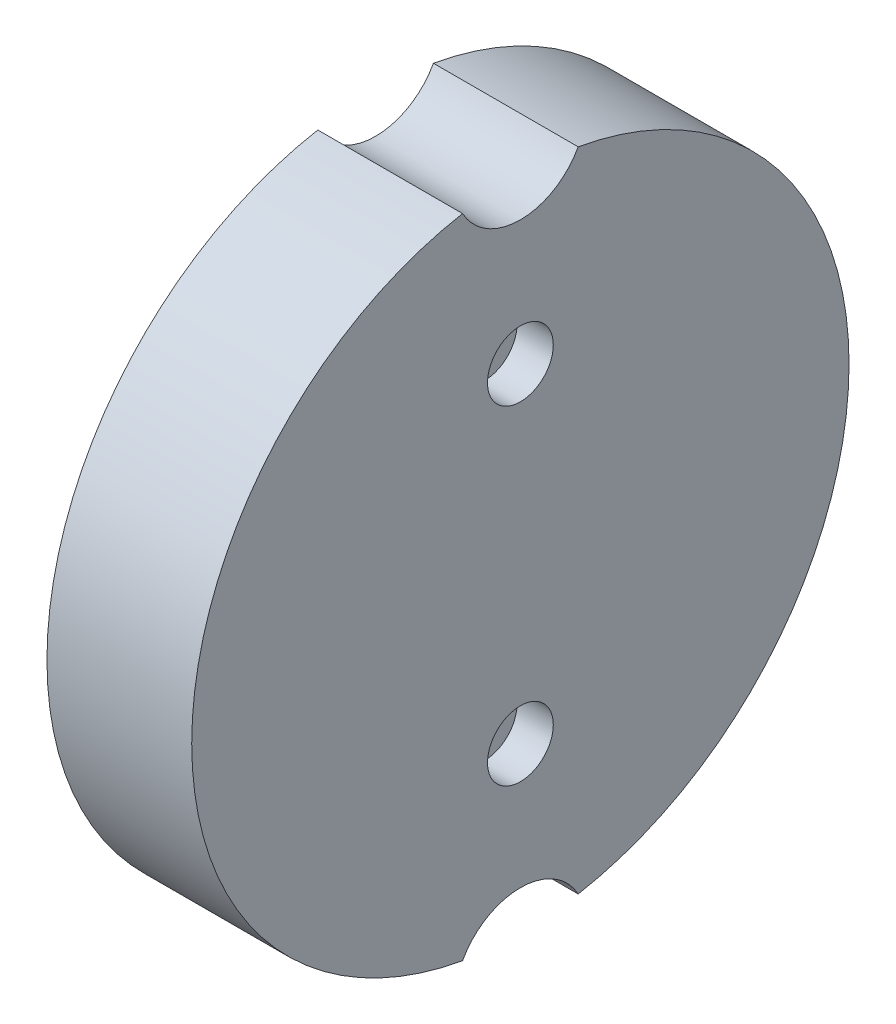
ISO-10303-21;
HEADER;
FILE_DESCRIPTION(('STEP AP214'),'2;1');
FILE_NAME('part.step','',(''),(''),'','','');
FILE_SCHEMA(('AUTOMOTIVE_DESIGN { 1 0 10303 214 1 1 1 1 }'));
ENDSEC;
DATA;
#1=APPLICATION_CONTEXT('core data for automotive mechanical design processes');
#2=APPLICATION_PROTOCOL_DEFINITION('international standard','automotive_design',2000,#1);
#3=PRODUCT_CONTEXT('',#1,'mechanical');
#4=PRODUCT('Part','Part','',(#3));
#5=PRODUCT_RELATED_PRODUCT_CATEGORY('part','',(#4));
#6=PRODUCT_DEFINITION_FORMATION('','',#4);
#7=PRODUCT_DEFINITION_CONTEXT('part definition',#1,'design');
#8=PRODUCT_DEFINITION('design','',#6,#7);
#9=PRODUCT_DEFINITION_SHAPE('','',#8);
#10=(LENGTH_UNIT() NAMED_UNIT(*) SI_UNIT(.MILLI.,.METRE.));
#11=(NAMED_UNIT(*) PLANE_ANGLE_UNIT() SI_UNIT($,.RADIAN.));
#12=(NAMED_UNIT(*) SI_UNIT($,.STERADIAN.) SOLID_ANGLE_UNIT());
#13=UNCERTAINTY_MEASURE_WITH_UNIT(LENGTH_MEASURE(1.E-05),#10,'distance_accuracy_value','');
#14=(GEOMETRIC_REPRESENTATION_CONTEXT(3) GLOBAL_UNCERTAINTY_ASSIGNED_CONTEXT((#13)) GLOBAL_UNIT_ASSIGNED_CONTEXT((#10,
#11,#12)) REPRESENTATION_CONTEXT('',''));
#15=CARTESIAN_POINT('',(0.,0.,0.));
#16=DIRECTION('',(0.,0.,1.));
#17=DIRECTION('',(1.,0.,0.));
#18=AXIS2_PLACEMENT_3D('',#15,#16,#17);
#19=CARTESIAN_POINT('',(36.46,-2.5,0.));
#20=DIRECTION('',(-1.,0.,0.));
#21=DIRECTION('',(0.,0.,1.));
#22=AXIS2_PLACEMENT_3D('',#19,#20,#21);
#23=PLANE('',#22);
#24=CARTESIAN_POINT('',(36.46,-2.5,0.));
#25=DIRECTION('',(1.,0.,0.));
#26=DIRECTION('',(0.,0.,-1.));
#27=AXIS2_PLACEMENT_3D('',#24,#25,#26);
#28=CIRCLE('',#27,0.5);
#29=CARTESIAN_POINT('',(36.46,-2.5,-0.5));
#30=VERTEX_POINT('',#29);
#31=EDGE_CURVE('E19',#30,#30,#28,.T.);
#32=ORIENTED_EDGE('',*,*,#31,.T.);
#33=EDGE_LOOP('',(#32));
#34=FACE_BOUND('',#33,.T.);
#35=ADVANCED_FACE('F16',(#34),#23,.F.);
#36=CARTESIAN_POINT('',(36.46,2.5,0.));
#37=DIRECTION('',(-1.,0.,0.));
#38=DIRECTION('',(0.,0.,1.));
#39=AXIS2_PLACEMENT_3D('',#36,#37,#38);
#40=PLANE('',#39);
#41=CARTESIAN_POINT('',(36.46,2.5,0.));
#42=DIRECTION('',(1.,0.,0.));
#43=DIRECTION('',(0.,0.,-1.));
#44=AXIS2_PLACEMENT_3D('',#41,#42,#43);
#45=CIRCLE('',#44,0.5);
#46=CARTESIAN_POINT('',(36.46,2.5,-0.5));
#47=VERTEX_POINT('',#46);
#48=EDGE_CURVE('E96',#47,#47,#45,.T.);
#49=ORIENTED_EDGE('',*,*,#48,.T.);
#50=EDGE_LOOP('',(#49));
#51=FACE_BOUND('',#50,.T.);
#52=ADVANCED_FACE('F107',(#51),#40,.F.);
#53=CARTESIAN_POINT('',(36.735,-2.5,0.));
#54=DIRECTION('',(1.,0.,0.));
#55=DIRECTION('',(0.,0.,-1.));
#56=AXIS2_PLACEMENT_3D('',#53,#54,#55);
#57=CYLINDRICAL_SURFACE('',#56,0.5);
#58=CARTESIAN_POINT('',(37.01,-2.5,0.));
#59=DIRECTION('',(1.,0.,0.));
#60=DIRECTION('',(0.,0.,-1.));
#61=AXIS2_PLACEMENT_3D('',#58,#59,#60);
#62=CIRCLE('',#61,0.5);
#63=CARTESIAN_POINT('',(37.01,-2.5,-0.5));
#64=VERTEX_POINT('',#63);
#65=EDGE_CURVE('E94',#64,#64,#62,.F.);
#66=ORIENTED_EDGE('',*,*,#65,.F.);
#67=EDGE_LOOP('',(#66));
#68=FACE_BOUND('',#67,.T.);
#69=ORIENTED_EDGE('',*,*,#31,.F.);
#70=EDGE_LOOP('',(#69));
#71=FACE_BOUND('',#70,.T.);
#72=ADVANCED_FACE('F104',(#68,#71),#57,.F.);
#73=CARTESIAN_POINT('',(36.735,2.5,0.));
#74=DIRECTION('',(1.,0.,0.));
#75=DIRECTION('',(0.,0.,-1.));
#76=AXIS2_PLACEMENT_3D('',#73,#74,#75);
#77=CYLINDRICAL_SURFACE('',#76,0.5);
#78=CARTESIAN_POINT('',(37.01,2.5,0.));
#79=DIRECTION('',(1.,0.,0.));
#80=DIRECTION('',(0.,0.,-1.));
#81=AXIS2_PLACEMENT_3D('',#78,#79,#80);
#82=CIRCLE('',#81,0.5);
#83=CARTESIAN_POINT('',(37.01,2.5,-0.5));
#84=VERTEX_POINT('',#83);
#85=EDGE_CURVE('E74',#84,#84,#82,.F.);
#86=ORIENTED_EDGE('',*,*,#85,.F.);
#87=EDGE_LOOP('',(#86));
#88=FACE_BOUND('',#87,.T.);
#89=ORIENTED_EDGE('',*,*,#48,.F.);
#90=EDGE_LOOP('',(#89));
#91=FACE_BOUND('',#90,.T.);
#92=ADVANCED_FACE('F106',(#88,#91),#77,.F.);
#93=CARTESIAN_POINT('',(37.01,0.,2.4975));
#94=DIRECTION('',(1.,0.,0.));
#95=DIRECTION('',(0.,0.,-1.));
#96=AXIS2_PLACEMENT_3D('',#93,#94,#95);
#97=PLANE('',#96);
#98=CARTESIAN_POINT('',(37.01,0.,0.));
#99=DIRECTION('',(-1.,0.,0.));
#100=DIRECTION('',(0.,0.,1.));
#101=AXIS2_PLACEMENT_3D('',#98,#99,#100);
#102=CIRCLE('',#101,4.995);
#103=CARTESIAN_POINT('',(37.01,-4.91715013901761,0.878441523585437));
#104=VERTEX_POINT('',#103);
#105=CARTESIAN_POINT('',(37.01,4.91715013901761,0.878441523585441));
#106=VERTEX_POINT('',#105);
#107=EDGE_CURVE('E54',#104,#106,#102,.T.);
#108=ORIENTED_EDGE('',*,*,#107,.F.);
#109=CARTESIAN_POINT('',(37.01,-5.395,0.));
#110=DIRECTION('',(-1.,0.,0.));
#111=DIRECTION('',(0.,0.,1.));
#112=AXIS2_PLACEMENT_3D('',#109,#110,#111);
#113=CIRCLE('',#112,1.);
#114=CARTESIAN_POINT('',(37.01,-4.91715013901761,-0.878441523585438));
#115=VERTEX_POINT('',#114);
#116=EDGE_CURVE('E58',#104,#115,#113,.T.);
#117=ORIENTED_EDGE('',*,*,#116,.T.);
#118=CARTESIAN_POINT('',(37.01,0.,0.));
#119=DIRECTION('',(-1.,0.,0.));
#120=DIRECTION('',(0.,0.,1.));
#121=AXIS2_PLACEMENT_3D('',#118,#119,#120);
#122=CIRCLE('',#121,4.995);
#123=CARTESIAN_POINT('',(37.01,4.91715013901761,-0.878441523585439));
#124=VERTEX_POINT('',#123);
#125=EDGE_CURVE('E89',#124,#115,#122,.T.);
#126=ORIENTED_EDGE('',*,*,#125,.F.);
#127=CARTESIAN_POINT('',(37.01,5.395,0.));
#128=DIRECTION('',(-1.,0.,0.));
#129=DIRECTION('',(0.,0.,1.));
#130=AXIS2_PLACEMENT_3D('',#127,#128,#129);
#131=CIRCLE('',#130,1.);
#132=EDGE_CURVE('E60',#124,#106,#131,.T.);
#133=ORIENTED_EDGE('',*,*,#132,.T.);
#134=EDGE_LOOP('',(#108,#117,#126,#133));
#135=FACE_BOUND('',#134,.T.);
#136=ORIENTED_EDGE('',*,*,#85,.T.);
#137=EDGE_LOOP('',(#136));
#138=FACE_BOUND('',#137,.T.);
#139=ORIENTED_EDGE('',*,*,#65,.T.);
#140=EDGE_LOOP('',(#139));
#141=FACE_BOUND('',#140,.T.);
#142=ADVANCED_FACE('F56',(#135,#138,#141),#97,.T.);
#143=CARTESIAN_POINT('',(35.91,-5.395,0.));
#144=DIRECTION('',(-1.,0.,0.));
#145=DIRECTION('',(0.,0.,1.));
#146=AXIS2_PLACEMENT_3D('',#143,#144,#145);
#147=CYLINDRICAL_SURFACE('',#146,1.);
#148=CARTESIAN_POINT('',(34.81,-5.395,0.));
#149=DIRECTION('',(-1.,0.,0.));
#150=DIRECTION('',(0.,0.,1.));
#151=AXIS2_PLACEMENT_3D('',#148,#149,#150);
#152=CIRCLE('',#151,1.);
#153=CARTESIAN_POINT('',(34.81,-4.91715013901761,-0.878441523585438));
#154=VERTEX_POINT('',#153);
#155=CARTESIAN_POINT('',(34.81,-4.91715013901761,0.878441523585436));
#156=VERTEX_POINT('',#155);
#157=EDGE_CURVE('E87',#154,#156,#152,.F.);
#158=ORIENTED_EDGE('',*,*,#157,.F.);
#159=DIRECTION('',(-1.,0.,0.));
#160=VECTOR('',#159,1.);
#161=CARTESIAN_POINT('',(35.91,-4.91715013901761,-0.878441523585436));
#162=LINE('',#161,#160);
#163=EDGE_CURVE('E72',#115,#154,#162,.T.);
#164=ORIENTED_EDGE('',*,*,#163,.F.);
#165=ORIENTED_EDGE('',*,*,#116,.F.);
#166=DIRECTION('',(-1.,0.,0.));
#167=VECTOR('',#166,1.);
#168=CARTESIAN_POINT('',(35.91,-4.91715013901761,0.878441523585434));
#169=LINE('',#168,#167);
#170=EDGE_CURVE('E65',#156,#104,#169,.F.);
#171=ORIENTED_EDGE('',*,*,#170,.F.);
#172=EDGE_LOOP('',(#158,#164,#165,#171));
#173=FACE_BOUND('',#172,.T.);
#174=ADVANCED_FACE('F69',(#173),#147,.F.);
#175=CARTESIAN_POINT('',(35.91,0.,0.));
#176=DIRECTION('',(-1.,0.,0.));
#177=DIRECTION('',(0.,0.,1.));
#178=AXIS2_PLACEMENT_3D('',#175,#176,#177);
#179=CYLINDRICAL_SURFACE('',#178,4.995);
#180=DIRECTION('',(-1.,0.,0.));
#181=VECTOR('',#180,1.);
#182=CARTESIAN_POINT('',(35.91,4.91715013901761,0.87844152358544));
#183=LINE('',#182,#181);
#184=CARTESIAN_POINT('',(34.81,4.91715013901761,0.878441523585441));
#185=VERTEX_POINT('',#184);
#186=EDGE_CURVE('E81',#106,#185,#183,.T.);
#187=ORIENTED_EDGE('',*,*,#186,.T.);
#188=CARTESIAN_POINT('',(34.81,0.,0.));
#189=DIRECTION('',(-1.,0.,0.));
#190=DIRECTION('',(0.,0.,1.));
#191=AXIS2_PLACEMENT_3D('',#188,#189,#190);
#192=CIRCLE('',#191,4.995);
#193=EDGE_CURVE('E77',#156,#185,#192,.T.);
#194=ORIENTED_EDGE('',*,*,#193,.F.);
#195=ORIENTED_EDGE('',*,*,#170,.T.);
#196=ORIENTED_EDGE('',*,*,#107,.T.);
#197=EDGE_LOOP('',(#187,#194,#195,#196));
#198=FACE_BOUND('',#197,.T.);
#199=ADVANCED_FACE('F76',(#198),#179,.T.);
#200=CARTESIAN_POINT('',(35.91,5.395,0.));
#201=DIRECTION('',(-1.,0.,0.));
#202=DIRECTION('',(0.,0.,1.));
#203=AXIS2_PLACEMENT_3D('',#200,#201,#202);
#204=CYLINDRICAL_SURFACE('',#203,1.);
#205=CARTESIAN_POINT('',(34.81,5.395,0.));
#206=DIRECTION('',(-1.,0.,0.));
#207=DIRECTION('',(0.,0.,1.));
#208=AXIS2_PLACEMENT_3D('',#205,#206,#207);
#209=CIRCLE('',#208,1.);
#210=CARTESIAN_POINT('',(34.81,4.91715013901761,-0.878441523585437));
#211=VERTEX_POINT('',#210);
#212=EDGE_CURVE('E25',#185,#211,#209,.F.);
#213=ORIENTED_EDGE('',*,*,#212,.F.);
#214=ORIENTED_EDGE('',*,*,#186,.F.);
#215=ORIENTED_EDGE('',*,*,#132,.F.);
#216=DIRECTION('',(-1.,0.,0.));
#217=VECTOR('',#216,1.);
#218=CARTESIAN_POINT('',(35.91,4.91715013901761,-0.878441523585437));
#219=LINE('',#218,#217);
#220=EDGE_CURVE('E34',#211,#124,#219,.F.);
#221=ORIENTED_EDGE('',*,*,#220,.F.);
#222=EDGE_LOOP('',(#213,#214,#215,#221));
#223=FACE_BOUND('',#222,.T.);
#224=ADVANCED_FACE('F126',(#223),#204,.F.);
#225=CARTESIAN_POINT('',(35.91,0.,0.));
#226=DIRECTION('',(-1.,0.,0.));
#227=DIRECTION('',(0.,0.,1.));
#228=AXIS2_PLACEMENT_3D('',#225,#226,#227);
#229=CYLINDRICAL_SURFACE('',#228,4.995);
#230=ORIENTED_EDGE('',*,*,#163,.T.);
#231=CARTESIAN_POINT('',(34.81,0.,0.));
#232=DIRECTION('',(-1.,0.,0.));
#233=DIRECTION('',(0.,0.,1.));
#234=AXIS2_PLACEMENT_3D('',#231,#232,#233);
#235=CIRCLE('',#234,4.995);
#236=EDGE_CURVE('E11',#211,#154,#235,.T.);
#237=ORIENTED_EDGE('',*,*,#236,.F.);
#238=ORIENTED_EDGE('',*,*,#220,.T.);
#239=ORIENTED_EDGE('',*,*,#125,.T.);
#240=EDGE_LOOP('',(#230,#237,#238,#239));
#241=FACE_BOUND('',#240,.T.);
#242=ADVANCED_FACE('F120',(#241),#229,.T.);
#243=CARTESIAN_POINT('',(34.81,0.,2.4975));
#244=DIRECTION('',(-1.,0.,0.));
#245=DIRECTION('',(0.,0.,1.));
#246=AXIS2_PLACEMENT_3D('',#243,#244,#245);
#247=PLANE('',#246);
#248=ORIENTED_EDGE('',*,*,#236,.T.);
#249=ORIENTED_EDGE('',*,*,#157,.T.);
#250=ORIENTED_EDGE('',*,*,#193,.T.);
#251=ORIENTED_EDGE('',*,*,#212,.T.);
#252=EDGE_LOOP('',(#248,#249,#250,#251));
#253=FACE_BOUND('',#252,.T.);
#254=ADVANCED_FACE('F118',(#253),#247,.T.);
#255=CLOSED_SHELL('',(#35,#52,#72,#92,#142,#174,#199,#224,#242,#254));
#256=MANIFOLD_SOLID_BREP('B1',#255);
#257=ADVANCED_BREP_SHAPE_REPRESENTATION('',(#18,#256),#14);
#258=SHAPE_DEFINITION_REPRESENTATION(#9,#257);
ENDSEC;
END-ISO-10303-21;
